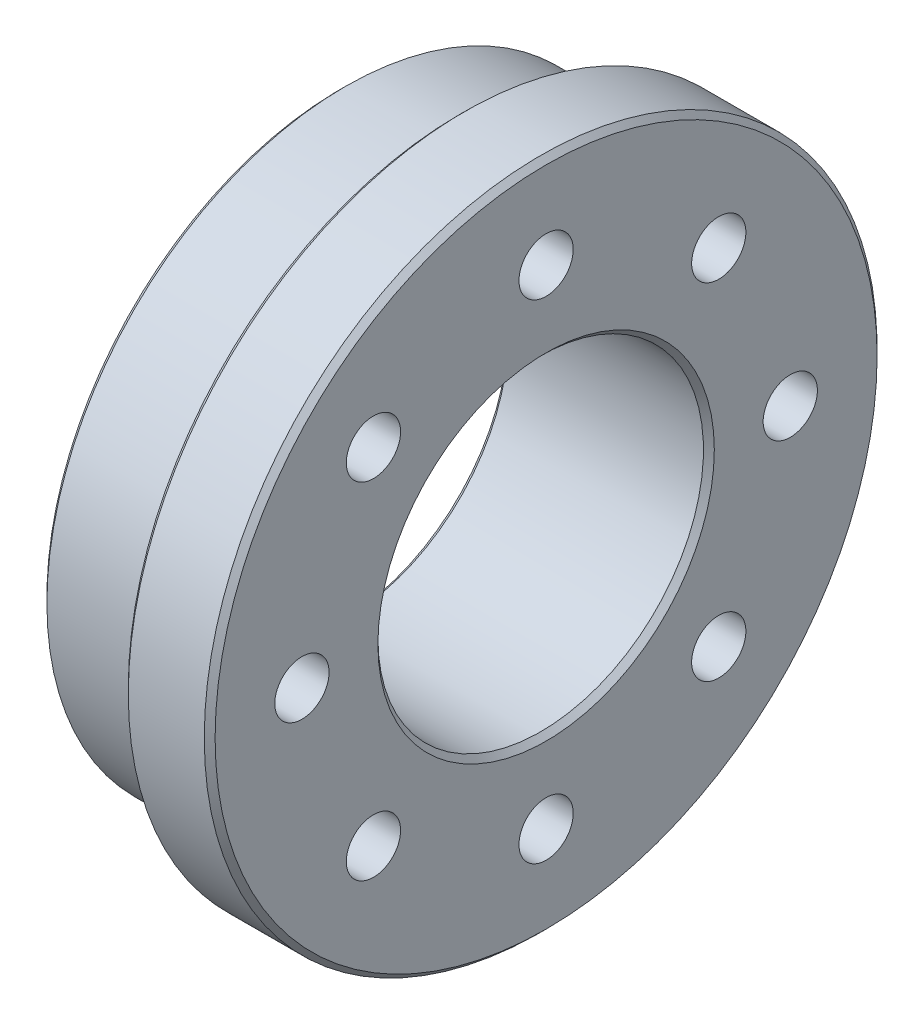
ISO-10303-21;
HEADER;
FILE_DESCRIPTION(('STEP AP214'),'2;1');
FILE_NAME('part.step','',(''),(''),'','','');
FILE_SCHEMA(('AUTOMOTIVE_DESIGN { 1 0 10303 214 1 1 1 1 }'));
ENDSEC;
DATA;
#1=APPLICATION_CONTEXT('core data for automotive mechanical design processes');
#2=APPLICATION_PROTOCOL_DEFINITION('international standard','automotive_design',2000,#1);
#3=PRODUCT_CONTEXT('',#1,'mechanical');
#4=PRODUCT('Part','Part','',(#3));
#5=PRODUCT_RELATED_PRODUCT_CATEGORY('part','',(#4));
#6=PRODUCT_DEFINITION_FORMATION('','',#4);
#7=PRODUCT_DEFINITION_CONTEXT('part definition',#1,'design');
#8=PRODUCT_DEFINITION('design','',#6,#7);
#9=PRODUCT_DEFINITION_SHAPE('','',#8);
#10=(LENGTH_UNIT() NAMED_UNIT(*) SI_UNIT(.MILLI.,.METRE.));
#11=(NAMED_UNIT(*) PLANE_ANGLE_UNIT() SI_UNIT($,.RADIAN.));
#12=(NAMED_UNIT(*) SI_UNIT($,.STERADIAN.) SOLID_ANGLE_UNIT());
#13=UNCERTAINTY_MEASURE_WITH_UNIT(LENGTH_MEASURE(1.E-05),#10,'distance_accuracy_value','');
#14=(GEOMETRIC_REPRESENTATION_CONTEXT(3) GLOBAL_UNCERTAINTY_ASSIGNED_CONTEXT((#13)) GLOBAL_UNIT_ASSIGNED_CONTEXT((#10,
#11,#12)) REPRESENTATION_CONTEXT('',''));
#15=CARTESIAN_POINT('',(0.,0.,0.));
#16=DIRECTION('',(0.,0.,1.));
#17=DIRECTION('',(1.,0.,0.));
#18=AXIS2_PLACEMENT_3D('',#15,#16,#17);
#19=CARTESIAN_POINT('',(0.,27.5,0.));
#20=DIRECTION('',(1.,0.,0.));
#21=DIRECTION('',(0.,0.,-1.));
#22=AXIS2_PLACEMENT_3D('',#19,#20,#21);
#23=PLANE('',#22);
#24=CARTESIAN_POINT('',(0.,0.,0.));
#25=DIRECTION('',(1.,0.,0.));
#26=DIRECTION('',(0.,0.,-1.));
#27=AXIS2_PLACEMENT_3D('',#24,#25,#26);
#28=CIRCLE('',#27,27.);
#29=CARTESIAN_POINT('',(0.,0.,-27.));
#30=VERTEX_POINT('',#29);
#31=EDGE_CURVE('E58',#30,#30,#28,.F.);
#32=ORIENTED_EDGE('',*,*,#31,.T.);
#33=EDGE_LOOP('',(#32));
#34=FACE_BOUND('',#33,.T.);
#35=CARTESIAN_POINT('',(0.,0.,0.));
#36=DIRECTION('',(1.,0.,0.));
#37=DIRECTION('',(0.,0.,-1.));
#38=AXIS2_PLACEMENT_3D('',#35,#36,#37);
#39=CIRCLE('',#38,15.5);
#40=CARTESIAN_POINT('',(0.,0.,-15.5));
#41=VERTEX_POINT('',#40);
#42=EDGE_CURVE('E64',#41,#41,#39,.T.);
#43=ORIENTED_EDGE('',*,*,#42,.T.);
#44=EDGE_LOOP('',(#43));
#45=FACE_BOUND('',#44,.T.);
#46=ADVANCED_FACE('F39',(#34,#45),#23,.F.);
#47=CARTESIAN_POINT('',(0.,0.,0.));
#48=DIRECTION('',(-1.,0.,0.));
#49=DIRECTION('',(0.,0.,1.));
#50=AXIS2_PLACEMENT_3D('',#47,#48,#49);
#51=CYLINDRICAL_SURFACE('',#50,15.);
#52=CARTESIAN_POINT('',(0.499999999999998,0.,0.));
#53=DIRECTION('',(1.,0.,0.));
#54=DIRECTION('',(0.,0.,-1.));
#55=AXIS2_PLACEMENT_3D('',#52,#53,#54);
#56=CIRCLE('',#55,15.);
#57=CARTESIAN_POINT('',(0.499999999999998,0.,-15.));
#58=VERTEX_POINT('',#57);
#59=EDGE_CURVE('E10',#58,#58,#56,.F.);
#60=ORIENTED_EDGE('',*,*,#59,.T.);
#61=EDGE_LOOP('',(#60));
#62=FACE_BOUND('',#61,.T.);
#63=CARTESIAN_POINT('',(18.5,0.,0.));
#64=DIRECTION('',(-1.,0.,0.));
#65=DIRECTION('',(0.,0.,1.));
#66=AXIS2_PLACEMENT_3D('',#63,#64,#65);
#67=CIRCLE('',#66,15.);
#68=CARTESIAN_POINT('',(18.5,0.,15.));
#69=VERTEX_POINT('',#68);
#70=EDGE_CURVE('E48',#69,#69,#67,.F.);
#71=ORIENTED_EDGE('',*,*,#70,.T.);
#72=EDGE_LOOP('',(#71));
#73=FACE_BOUND('',#72,.T.);
#74=ADVANCED_FACE('F170',(#62,#73),#51,.F.);
#75=CARTESIAN_POINT('',(19.,15.,0.));
#76=DIRECTION('',(-1.,0.,0.));
#77=DIRECTION('',(0.,0.,1.));
#78=AXIS2_PLACEMENT_3D('',#75,#76,#77);
#79=PLANE('',#78);
#80=CARTESIAN_POINT('',(19.,0.,0.));
#81=DIRECTION('',(-1.,0.,0.));
#82=DIRECTION('',(0.,0.,1.));
#83=AXIS2_PLACEMENT_3D('',#80,#81,#82);
#84=CIRCLE('',#83,30.5);
#85=CARTESIAN_POINT('',(19.,0.,30.5));
#86=VERTEX_POINT('',#85);
#87=EDGE_CURVE('E72',#86,#86,#84,.F.);
#88=ORIENTED_EDGE('',*,*,#87,.T.);
#89=EDGE_LOOP('',(#88));
#90=FACE_BOUND('',#89,.T.);
#91=CARTESIAN_POINT('',(19.,0.,0.));
#92=DIRECTION('',(-1.,0.,0.));
#93=DIRECTION('',(0.,0.,1.));
#94=AXIS2_PLACEMENT_3D('',#91,#92,#93);
#95=CIRCLE('',#94,15.5);
#96=CARTESIAN_POINT('',(19.,0.,15.5));
#97=VERTEX_POINT('',#96);
#98=EDGE_CURVE('E76',#97,#97,#95,.T.);
#99=ORIENTED_EDGE('',*,*,#98,.T.);
#100=EDGE_LOOP('',(#99));
#101=FACE_BOUND('',#100,.T.);
#102=CARTESIAN_POINT('',(19.,22.5,0.));
#103=DIRECTION('',(1.,0.,0.));
#104=DIRECTION('',(0.,0.,-1.));
#105=AXIS2_PLACEMENT_3D('',#102,#103,#104);
#106=CIRCLE('',#105,2.5);
#107=CARTESIAN_POINT('',(19.,22.5,-2.5));
#108=VERTEX_POINT('',#107);
#109=EDGE_CURVE('E149',#108,#108,#106,.T.);
#110=ORIENTED_EDGE('',*,*,#109,.F.);
#111=EDGE_LOOP('',(#110));
#112=FACE_BOUND('',#111,.T.);
#113=CARTESIAN_POINT('',(19.,15.9099025766973,-15.9099025766973));
#114=DIRECTION('',(1.,0.,0.));
#115=DIRECTION('',(0.,0.,-1.));
#116=AXIS2_PLACEMENT_3D('',#113,#114,#115);
#117=CIRCLE('',#116,2.50000000000004);
#118=CARTESIAN_POINT('',(19.,15.9099025766973,-18.4099025766974));
#119=VERTEX_POINT('',#118);
#120=EDGE_CURVE('E141',#119,#119,#117,.T.);
#121=ORIENTED_EDGE('',*,*,#120,.F.);
#122=EDGE_LOOP('',(#121));
#123=FACE_BOUND('',#122,.T.);
#124=CARTESIAN_POINT('',(19.,0.,-22.5));
#125=DIRECTION('',(1.,0.,0.));
#126=DIRECTION('',(0.,0.,-1.));
#127=AXIS2_PLACEMENT_3D('',#124,#125,#126);
#128=CIRCLE('',#127,2.50000000000008);
#129=CARTESIAN_POINT('',(19.,0.,-25.0000000000001));
#130=VERTEX_POINT('',#129);
#131=EDGE_CURVE('E133',#130,#130,#128,.T.);
#132=ORIENTED_EDGE('',*,*,#131,.F.);
#133=EDGE_LOOP('',(#132));
#134=FACE_BOUND('',#133,.T.);
#135=CARTESIAN_POINT('',(19.,-15.9099025766973,-15.9099025766973));
#136=DIRECTION('',(1.,0.,0.));
#137=DIRECTION('',(0.,0.,-1.));
#138=AXIS2_PLACEMENT_3D('',#135,#136,#137);
#139=CIRCLE('',#138,2.50000000000011);
#140=CARTESIAN_POINT('',(19.,-15.9099025766973,-18.4099025766974));
#141=VERTEX_POINT('',#140);
#142=EDGE_CURVE('E125',#141,#141,#139,.T.);
#143=ORIENTED_EDGE('',*,*,#142,.F.);
#144=EDGE_LOOP('',(#143));
#145=FACE_BOUND('',#144,.T.);
#146=CARTESIAN_POINT('',(19.,-22.5,0.));
#147=DIRECTION('',(1.,0.,0.));
#148=DIRECTION('',(0.,0.,-1.));
#149=AXIS2_PLACEMENT_3D('',#146,#147,#148);
#150=CIRCLE('',#149,2.50000000000015);
#151=CARTESIAN_POINT('',(19.,-22.5,-2.50000000000015));
#152=VERTEX_POINT('',#151);
#153=EDGE_CURVE('E117',#152,#152,#150,.T.);
#154=ORIENTED_EDGE('',*,*,#153,.F.);
#155=EDGE_LOOP('',(#154));
#156=FACE_BOUND('',#155,.T.);
#157=CARTESIAN_POINT('',(19.,-15.9099025766973,15.9099025766973));
#158=DIRECTION('',(1.,0.,0.));
#159=DIRECTION('',(0.,0.,-1.));
#160=AXIS2_PLACEMENT_3D('',#157,#158,#159);
#161=CIRCLE('',#160,2.50000000000019);
#162=CARTESIAN_POINT('',(19.,-15.9099025766973,13.4099025766971));
#163=VERTEX_POINT('',#162);
#164=EDGE_CURVE('E109',#163,#163,#161,.T.);
#165=ORIENTED_EDGE('',*,*,#164,.F.);
#166=EDGE_LOOP('',(#165));
#167=FACE_BOUND('',#166,.T.);
#168=CARTESIAN_POINT('',(19.,0.,22.5));
#169=DIRECTION('',(1.,0.,0.));
#170=DIRECTION('',(0.,0.,-1.));
#171=AXIS2_PLACEMENT_3D('',#168,#169,#170);
#172=CIRCLE('',#171,2.50000000000023);
#173=CARTESIAN_POINT('',(19.,0.,19.9999999999998));
#174=VERTEX_POINT('',#173);
#175=EDGE_CURVE('E101',#174,#174,#172,.T.);
#176=ORIENTED_EDGE('',*,*,#175,.F.);
#177=EDGE_LOOP('',(#176));
#178=FACE_BOUND('',#177,.T.);
#179=CARTESIAN_POINT('',(19.,15.9099025766973,15.9099025766973));
#180=DIRECTION('',(1.,0.,0.));
#181=DIRECTION('',(0.,0.,-1.));
#182=AXIS2_PLACEMENT_3D('',#179,#180,#181);
#183=CIRCLE('',#182,2.50000000000027);
#184=CARTESIAN_POINT('',(19.,15.9099025766973,13.4099025766971));
#185=VERTEX_POINT('',#184);
#186=EDGE_CURVE('E93',#185,#185,#183,.T.);
#187=ORIENTED_EDGE('',*,*,#186,.F.);
#188=EDGE_LOOP('',(#187));
#189=FACE_BOUND('',#188,.T.);
#190=ADVANCED_FACE('F166',(#90,#101,#112,#123,#134,#145,#156,#167,#178,#189),#79,.F.);
#191=CARTESIAN_POINT('',(0.,0.,0.));
#192=DIRECTION('',(-1.,0.,0.));
#193=DIRECTION('',(0.,0.,1.));
#194=AXIS2_PLACEMENT_3D('',#191,#192,#193);
#195=CYLINDRICAL_SURFACE('',#194,31.);
#196=CARTESIAN_POINT('',(18.5,0.,0.));
#197=DIRECTION('',(-1.,0.,0.));
#198=DIRECTION('',(0.,0.,1.));
#199=AXIS2_PLACEMENT_3D('',#196,#197,#198);
#200=CIRCLE('',#199,31.);
#201=CARTESIAN_POINT('',(18.5,0.,31.));
#202=VERTEX_POINT('',#201);
#203=EDGE_CURVE('E80',#202,#202,#200,.T.);
#204=ORIENTED_EDGE('',*,*,#203,.T.);
#205=EDGE_LOOP('',(#204));
#206=FACE_BOUND('',#205,.T.);
#207=CARTESIAN_POINT('',(11.5,0.,0.));
#208=DIRECTION('',(1.,0.,0.));
#209=DIRECTION('',(0.,0.,-1.));
#210=AXIS2_PLACEMENT_3D('',#207,#208,#209);
#211=CIRCLE('',#210,31.);
#212=CARTESIAN_POINT('',(11.5,0.,-31.));
#213=VERTEX_POINT('',#212);
#214=EDGE_CURVE('E84',#213,#213,#211,.T.);
#215=ORIENTED_EDGE('',*,*,#214,.T.);
#216=EDGE_LOOP('',(#215));
#217=FACE_BOUND('',#216,.T.);
#218=ADVANCED_FACE('F169',(#206,#217),#195,.T.);
#219=CARTESIAN_POINT('',(11.,31.,0.));
#220=DIRECTION('',(1.,0.,0.));
#221=DIRECTION('',(0.,0.,-1.));
#222=AXIS2_PLACEMENT_3D('',#219,#220,#221);
#223=PLANE('',#222);
#224=CARTESIAN_POINT('',(11.,0.,0.));
#225=DIRECTION('',(1.,0.,0.));
#226=DIRECTION('',(0.,0.,-1.));
#227=AXIS2_PLACEMENT_3D('',#224,#225,#226);
#228=CIRCLE('',#227,30.5);
#229=CARTESIAN_POINT('',(11.,0.,-30.5));
#230=VERTEX_POINT('',#229);
#231=EDGE_CURVE('E68',#230,#230,#228,.F.);
#232=ORIENTED_EDGE('',*,*,#231,.T.);
#233=EDGE_LOOP('',(#232));
#234=FACE_BOUND('',#233,.T.);
#235=CARTESIAN_POINT('',(11.,0.,0.));
#236=DIRECTION('',(-1.,0.,0.));
#237=DIRECTION('',(0.,0.,1.));
#238=AXIS2_PLACEMENT_3D('',#235,#236,#237);
#239=CIRCLE('',#238,27.5);
#240=CARTESIAN_POINT('',(11.,0.,27.5));
#241=VERTEX_POINT('',#240);
#242=EDGE_CURVE('E88',#241,#241,#239,.T.);
#243=ORIENTED_EDGE('',*,*,#242,.F.);
#244=EDGE_LOOP('',(#243));
#245=FACE_BOUND('',#244,.T.);
#246=ADVANCED_FACE('F200',(#234,#245),#223,.F.);
#247=CARTESIAN_POINT('',(0.,0.,0.));
#248=DIRECTION('',(-1.,0.,0.));
#249=DIRECTION('',(0.,0.,1.));
#250=AXIS2_PLACEMENT_3D('',#247,#248,#249);
#251=CYLINDRICAL_SURFACE('',#250,27.5);
#252=CARTESIAN_POINT('',(0.499999999999994,0.,0.));
#253=DIRECTION('',(1.,0.,0.));
#254=DIRECTION('',(0.,0.,-1.));
#255=AXIS2_PLACEMENT_3D('',#252,#253,#254);
#256=CIRCLE('',#255,27.5);
#257=CARTESIAN_POINT('',(0.499999999999994,0.,-27.5));
#258=VERTEX_POINT('',#257);
#259=EDGE_CURVE('E53',#258,#258,#256,.T.);
#260=ORIENTED_EDGE('',*,*,#259,.T.);
#261=EDGE_LOOP('',(#260));
#262=FACE_BOUND('',#261,.T.);
#263=ORIENTED_EDGE('',*,*,#242,.T.);
#264=EDGE_LOOP('',(#263));
#265=FACE_BOUND('',#264,.T.);
#266=ADVANCED_FACE('F190',(#262,#265),#251,.T.);
#267=CARTESIAN_POINT('',(4.,15.9099025766973,15.9099025766973));
#268=DIRECTION('',(1.,0.,0.));
#269=DIRECTION('',(0.,0.,-1.));
#270=AXIS2_PLACEMENT_3D('',#267,#268,#269);
#271=CYLINDRICAL_SURFACE('',#270,2.50000000000027);
#272=CARTESIAN_POINT('',(4.,15.9099025766973,15.9099025766973));
#273=DIRECTION('',(1.,0.,0.));
#274=DIRECTION('',(0.,0.,-1.));
#275=AXIS2_PLACEMENT_3D('',#272,#273,#274);
#276=CIRCLE('',#275,2.50000000000027);
#277=CARTESIAN_POINT('',(4.,15.9099025766973,13.4099025766971));
#278=VERTEX_POINT('',#277);
#279=EDGE_CURVE('E97',#278,#278,#276,.T.);
#280=ORIENTED_EDGE('',*,*,#279,.F.);
#281=EDGE_LOOP('',(#280));
#282=FACE_BOUND('',#281,.T.);
#283=ORIENTED_EDGE('',*,*,#186,.T.);
#284=EDGE_LOOP('',(#283));
#285=FACE_BOUND('',#284,.T.);
#286=ADVANCED_FACE('F187',(#282,#285),#271,.F.);
#287=CARTESIAN_POINT('',(4.,15.9099025766973,15.9099025766973));
#288=DIRECTION('',(1.,0.,0.));
#289=DIRECTION('',(0.,0.,-1.));
#290=AXIS2_PLACEMENT_3D('',#287,#288,#289);
#291=PLANE('',#290);
#292=ORIENTED_EDGE('',*,*,#279,.T.);
#293=EDGE_LOOP('',(#292));
#294=FACE_BOUND('',#293,.T.);
#295=ADVANCED_FACE('F189',(#294),#291,.T.);
#296=CARTESIAN_POINT('',(4.,0.,22.5));
#297=DIRECTION('',(1.,0.,0.));
#298=DIRECTION('',(0.,0.,-1.));
#299=AXIS2_PLACEMENT_3D('',#296,#297,#298);
#300=CYLINDRICAL_SURFACE('',#299,2.50000000000023);
#301=CARTESIAN_POINT('',(4.,0.,22.5));
#302=DIRECTION('',(1.,0.,0.));
#303=DIRECTION('',(0.,0.,-1.));
#304=AXIS2_PLACEMENT_3D('',#301,#302,#303);
#305=CIRCLE('',#304,2.50000000000023);
#306=CARTESIAN_POINT('',(4.,0.,19.9999999999998));
#307=VERTEX_POINT('',#306);
#308=EDGE_CURVE('E105',#307,#307,#305,.T.);
#309=ORIENTED_EDGE('',*,*,#308,.F.);
#310=EDGE_LOOP('',(#309));
#311=FACE_BOUND('',#310,.T.);
#312=ORIENTED_EDGE('',*,*,#175,.T.);
#313=EDGE_LOOP('',(#312));
#314=FACE_BOUND('',#313,.T.);
#315=ADVANCED_FACE('F197',(#311,#314),#300,.F.);
#316=CARTESIAN_POINT('',(4.,0.,22.5));
#317=DIRECTION('',(1.,0.,0.));
#318=DIRECTION('',(0.,0.,-1.));
#319=AXIS2_PLACEMENT_3D('',#316,#317,#318);
#320=PLANE('',#319);
#321=ORIENTED_EDGE('',*,*,#308,.T.);
#322=EDGE_LOOP('',(#321));
#323=FACE_BOUND('',#322,.T.);
#324=ADVANCED_FACE('F426',(#323),#320,.T.);
#325=CARTESIAN_POINT('',(4.,-15.9099025766973,15.9099025766973));
#326=DIRECTION('',(1.,0.,0.));
#327=DIRECTION('',(0.,0.,-1.));
#328=AXIS2_PLACEMENT_3D('',#325,#326,#327);
#329=CYLINDRICAL_SURFACE('',#328,2.50000000000019);
#330=CARTESIAN_POINT('',(4.,-15.9099025766973,15.9099025766973));
#331=DIRECTION('',(1.,0.,0.));
#332=DIRECTION('',(0.,0.,-1.));
#333=AXIS2_PLACEMENT_3D('',#330,#331,#332);
#334=CIRCLE('',#333,2.50000000000019);
#335=CARTESIAN_POINT('',(4.,-15.9099025766973,13.4099025766971));
#336=VERTEX_POINT('',#335);
#337=EDGE_CURVE('E113',#336,#336,#334,.T.);
#338=ORIENTED_EDGE('',*,*,#337,.F.);
#339=EDGE_LOOP('',(#338));
#340=FACE_BOUND('',#339,.T.);
#341=ORIENTED_EDGE('',*,*,#164,.T.);
#342=EDGE_LOOP('',(#341));
#343=FACE_BOUND('',#342,.T.);
#344=ADVANCED_FACE('F416',(#340,#343),#329,.F.);
#345=CARTESIAN_POINT('',(4.,-15.9099025766973,15.9099025766973));
#346=DIRECTION('',(1.,0.,0.));
#347=DIRECTION('',(0.,0.,-1.));
#348=AXIS2_PLACEMENT_3D('',#345,#346,#347);
#349=PLANE('',#348);
#350=ORIENTED_EDGE('',*,*,#337,.T.);
#351=EDGE_LOOP('',(#350));
#352=FACE_BOUND('',#351,.T.);
#353=ADVANCED_FACE('F406',(#352),#349,.T.);
#354=CARTESIAN_POINT('',(4.,-22.5,0.));
#355=DIRECTION('',(1.,0.,0.));
#356=DIRECTION('',(0.,0.,-1.));
#357=AXIS2_PLACEMENT_3D('',#354,#355,#356);
#358=CYLINDRICAL_SURFACE('',#357,2.50000000000015);
#359=CARTESIAN_POINT('',(4.,-22.5,0.));
#360=DIRECTION('',(1.,0.,0.));
#361=DIRECTION('',(0.,0.,-1.));
#362=AXIS2_PLACEMENT_3D('',#359,#360,#361);
#363=CIRCLE('',#362,2.50000000000015);
#364=CARTESIAN_POINT('',(4.,-22.5,-2.50000000000015));
#365=VERTEX_POINT('',#364);
#366=EDGE_CURVE('E121',#365,#365,#363,.T.);
#367=ORIENTED_EDGE('',*,*,#366,.F.);
#368=EDGE_LOOP('',(#367));
#369=FACE_BOUND('',#368,.T.);
#370=ORIENTED_EDGE('',*,*,#153,.T.);
#371=EDGE_LOOP('',(#370));
#372=FACE_BOUND('',#371,.T.);
#373=ADVANCED_FACE('F396',(#369,#372),#358,.F.);
#374=CARTESIAN_POINT('',(4.,-22.5,0.));
#375=DIRECTION('',(1.,0.,0.));
#376=DIRECTION('',(0.,0.,-1.));
#377=AXIS2_PLACEMENT_3D('',#374,#375,#376);
#378=PLANE('',#377);
#379=ORIENTED_EDGE('',*,*,#366,.T.);
#380=EDGE_LOOP('',(#379));
#381=FACE_BOUND('',#380,.T.);
#382=ADVANCED_FACE('F386',(#381),#378,.T.);
#383=CARTESIAN_POINT('',(4.,-15.9099025766973,-15.9099025766973));
#384=DIRECTION('',(1.,0.,0.));
#385=DIRECTION('',(0.,0.,-1.));
#386=AXIS2_PLACEMENT_3D('',#383,#384,#385);
#387=CYLINDRICAL_SURFACE('',#386,2.50000000000011);
#388=CARTESIAN_POINT('',(4.,-15.9099025766973,-15.9099025766973));
#389=DIRECTION('',(1.,0.,0.));
#390=DIRECTION('',(0.,0.,-1.));
#391=AXIS2_PLACEMENT_3D('',#388,#389,#390);
#392=CIRCLE('',#391,2.50000000000011);
#393=CARTESIAN_POINT('',(4.,-15.9099025766973,-18.4099025766974));
#394=VERTEX_POINT('',#393);
#395=EDGE_CURVE('E129',#394,#394,#392,.T.);
#396=ORIENTED_EDGE('',*,*,#395,.F.);
#397=EDGE_LOOP('',(#396));
#398=FACE_BOUND('',#397,.T.);
#399=ORIENTED_EDGE('',*,*,#142,.T.);
#400=EDGE_LOOP('',(#399));
#401=FACE_BOUND('',#400,.T.);
#402=ADVANCED_FACE('F376',(#398,#401),#387,.F.);
#403=CARTESIAN_POINT('',(4.,-15.9099025766973,-15.9099025766973));
#404=DIRECTION('',(1.,0.,0.));
#405=DIRECTION('',(0.,0.,-1.));
#406=AXIS2_PLACEMENT_3D('',#403,#404,#405);
#407=PLANE('',#406);
#408=ORIENTED_EDGE('',*,*,#395,.T.);
#409=EDGE_LOOP('',(#408));
#410=FACE_BOUND('',#409,.T.);
#411=ADVANCED_FACE('F366',(#410),#407,.T.);
#412=CARTESIAN_POINT('',(4.,0.,-22.5));
#413=DIRECTION('',(1.,0.,0.));
#414=DIRECTION('',(0.,0.,-1.));
#415=AXIS2_PLACEMENT_3D('',#412,#413,#414);
#416=CYLINDRICAL_SURFACE('',#415,2.50000000000008);
#417=CARTESIAN_POINT('',(4.,0.,-22.5));
#418=DIRECTION('',(1.,0.,0.));
#419=DIRECTION('',(0.,0.,-1.));
#420=AXIS2_PLACEMENT_3D('',#417,#418,#419);
#421=CIRCLE('',#420,2.50000000000008);
#422=CARTESIAN_POINT('',(4.,0.,-25.0000000000001));
#423=VERTEX_POINT('',#422);
#424=EDGE_CURVE('E137',#423,#423,#421,.T.);
#425=ORIENTED_EDGE('',*,*,#424,.F.);
#426=EDGE_LOOP('',(#425));
#427=FACE_BOUND('',#426,.T.);
#428=ORIENTED_EDGE('',*,*,#131,.T.);
#429=EDGE_LOOP('',(#428));
#430=FACE_BOUND('',#429,.T.);
#431=ADVANCED_FACE('F356',(#427,#430),#416,.F.);
#432=CARTESIAN_POINT('',(4.,0.,-22.5));
#433=DIRECTION('',(1.,0.,0.));
#434=DIRECTION('',(0.,0.,-1.));
#435=AXIS2_PLACEMENT_3D('',#432,#433,#434);
#436=PLANE('',#435);
#437=ORIENTED_EDGE('',*,*,#424,.T.);
#438=EDGE_LOOP('',(#437));
#439=FACE_BOUND('',#438,.T.);
#440=ADVANCED_FACE('F346',(#439),#436,.T.);
#441=CARTESIAN_POINT('',(4.,15.9099025766973,-15.9099025766973));
#442=DIRECTION('',(1.,0.,0.));
#443=DIRECTION('',(0.,0.,-1.));
#444=AXIS2_PLACEMENT_3D('',#441,#442,#443);
#445=CYLINDRICAL_SURFACE('',#444,2.50000000000004);
#446=CARTESIAN_POINT('',(4.,15.9099025766973,-15.9099025766973));
#447=DIRECTION('',(1.,0.,0.));
#448=DIRECTION('',(0.,0.,-1.));
#449=AXIS2_PLACEMENT_3D('',#446,#447,#448);
#450=CIRCLE('',#449,2.50000000000004);
#451=CARTESIAN_POINT('',(4.,15.9099025766973,-18.4099025766974));
#452=VERTEX_POINT('',#451);
#453=EDGE_CURVE('E145',#452,#452,#450,.T.);
#454=ORIENTED_EDGE('',*,*,#453,.F.);
#455=EDGE_LOOP('',(#454));
#456=FACE_BOUND('',#455,.T.);
#457=ORIENTED_EDGE('',*,*,#120,.T.);
#458=EDGE_LOOP('',(#457));
#459=FACE_BOUND('',#458,.T.);
#460=ADVANCED_FACE('F336',(#456,#459),#445,.F.);
#461=CARTESIAN_POINT('',(4.,15.9099025766973,-15.9099025766973));
#462=DIRECTION('',(1.,0.,0.));
#463=DIRECTION('',(0.,0.,-1.));
#464=AXIS2_PLACEMENT_3D('',#461,#462,#463);
#465=PLANE('',#464);
#466=ORIENTED_EDGE('',*,*,#453,.T.);
#467=EDGE_LOOP('',(#466));
#468=FACE_BOUND('',#467,.T.);
#469=ADVANCED_FACE('F162',(#468),#465,.T.);
#470=CARTESIAN_POINT('',(4.,22.5,0.));
#471=DIRECTION('',(1.,0.,0.));
#472=DIRECTION('',(0.,0.,-1.));
#473=AXIS2_PLACEMENT_3D('',#470,#471,#472);
#474=CYLINDRICAL_SURFACE('',#473,2.5);
#475=CARTESIAN_POINT('',(4.,22.5,0.));
#476=DIRECTION('',(1.,0.,0.));
#477=DIRECTION('',(0.,0.,-1.));
#478=AXIS2_PLACEMENT_3D('',#475,#476,#477);
#479=CIRCLE('',#478,2.5);
#480=CARTESIAN_POINT('',(4.,22.5,-2.5));
#481=VERTEX_POINT('',#480);
#482=EDGE_CURVE('E92',#481,#481,#479,.T.);
#483=ORIENTED_EDGE('',*,*,#482,.F.);
#484=EDGE_LOOP('',(#483));
#485=FACE_BOUND('',#484,.T.);
#486=ORIENTED_EDGE('',*,*,#109,.T.);
#487=EDGE_LOOP('',(#486));
#488=FACE_BOUND('',#487,.T.);
#489=ADVANCED_FACE('F159',(#485,#488),#474,.F.);
#490=CARTESIAN_POINT('',(4.,22.5,0.));
#491=DIRECTION('',(1.,0.,0.));
#492=DIRECTION('',(0.,0.,-1.));
#493=AXIS2_PLACEMENT_3D('',#490,#491,#492);
#494=PLANE('',#493);
#495=ORIENTED_EDGE('',*,*,#482,.T.);
#496=EDGE_LOOP('',(#495));
#497=FACE_BOUND('',#496,.T.);
#498=ADVANCED_FACE('F157',(#497),#494,.T.);
#499=CARTESIAN_POINT('',(18.5,0.,0.));
#500=DIRECTION('',(-1.,0.,0.));
#501=DIRECTION('',(0.,0.,1.));
#502=AXIS2_PLACEMENT_3D('',#499,#500,#501);
#503=CONICAL_SURFACE('',#502,31.,0.785398163397459);
#504=ORIENTED_EDGE('',*,*,#87,.F.);
#505=EDGE_LOOP('',(#504));
#506=FACE_BOUND('',#505,.T.);
#507=ORIENTED_EDGE('',*,*,#203,.F.);
#508=EDGE_LOOP('',(#507));
#509=FACE_BOUND('',#508,.T.);
#510=ADVANCED_FACE('F214',(#506,#509),#503,.T.);
#511=CARTESIAN_POINT('',(11.,0.,0.));
#512=DIRECTION('',(1.,0.,0.));
#513=DIRECTION('',(0.,0.,-1.));
#514=AXIS2_PLACEMENT_3D('',#511,#512,#513);
#515=CONICAL_SURFACE('',#514,30.5,0.785398163397448);
#516=ORIENTED_EDGE('',*,*,#214,.F.);
#517=EDGE_LOOP('',(#516));
#518=FACE_BOUND('',#517,.T.);
#519=ORIENTED_EDGE('',*,*,#231,.F.);
#520=EDGE_LOOP('',(#519));
#521=FACE_BOUND('',#520,.T.);
#522=ADVANCED_FACE('F220',(#518,#521),#515,.T.);
#523=CARTESIAN_POINT('',(0.,0.,0.));
#524=DIRECTION('',(1.,0.,0.));
#525=DIRECTION('',(0.,0.,-1.));
#526=AXIS2_PLACEMENT_3D('',#523,#524,#525);
#527=CONICAL_SURFACE('',#526,27.,0.785398163397441);
#528=ORIENTED_EDGE('',*,*,#259,.F.);
#529=EDGE_LOOP('',(#528));
#530=FACE_BOUND('',#529,.T.);
#531=ORIENTED_EDGE('',*,*,#31,.F.);
#532=EDGE_LOOP('',(#531));
#533=FACE_BOUND('',#532,.T.);
#534=ADVANCED_FACE('F227',(#530,#533),#527,.T.);
#535=CARTESIAN_POINT('',(0.499999999999998,0.,0.));
#536=DIRECTION('',(-1.,0.,0.));
#537=DIRECTION('',(0.,0.,1.));
#538=AXIS2_PLACEMENT_3D('',#535,#536,#537);
#539=CONICAL_SURFACE('',#538,15.,0.78539816339745);
#540=ORIENTED_EDGE('',*,*,#42,.F.);
#541=EDGE_LOOP('',(#540));
#542=FACE_BOUND('',#541,.T.);
#543=ORIENTED_EDGE('',*,*,#59,.F.);
#544=EDGE_LOOP('',(#543));
#545=FACE_BOUND('',#544,.T.);
#546=ADVANCED_FACE('F233',(#542,#545),#539,.F.);
#547=CARTESIAN_POINT('',(19.,0.,0.));
#548=DIRECTION('',(1.,0.,0.));
#549=DIRECTION('',(0.,0.,-1.));
#550=AXIS2_PLACEMENT_3D('',#547,#548,#549);
#551=CONICAL_SURFACE('',#550,15.5,0.785398163397454);
#552=ORIENTED_EDGE('',*,*,#70,.F.);
#553=EDGE_LOOP('',(#552));
#554=FACE_BOUND('',#553,.T.);
#555=ORIENTED_EDGE('',*,*,#98,.F.);
#556=EDGE_LOOP('',(#555));
#557=FACE_BOUND('',#556,.T.);
#558=ADVANCED_FACE('F42',(#554,#557),#551,.F.);
#559=CLOSED_SHELL('',(#46,#74,#190,#218,#246,#266,#286,#295,#315,#324,#344,#353,#373,#382,#402,
#411,#431,#440,#460,#469,#489,#498,#510,#522,#534,#546,#558));
#560=MANIFOLD_SOLID_BREP('B2',#559);
#561=ADVANCED_BREP_SHAPE_REPRESENTATION('',(#18,#560),#14);
#562=SHAPE_DEFINITION_REPRESENTATION(#9,#561);
ENDSEC;
END-ISO-10303-21;
